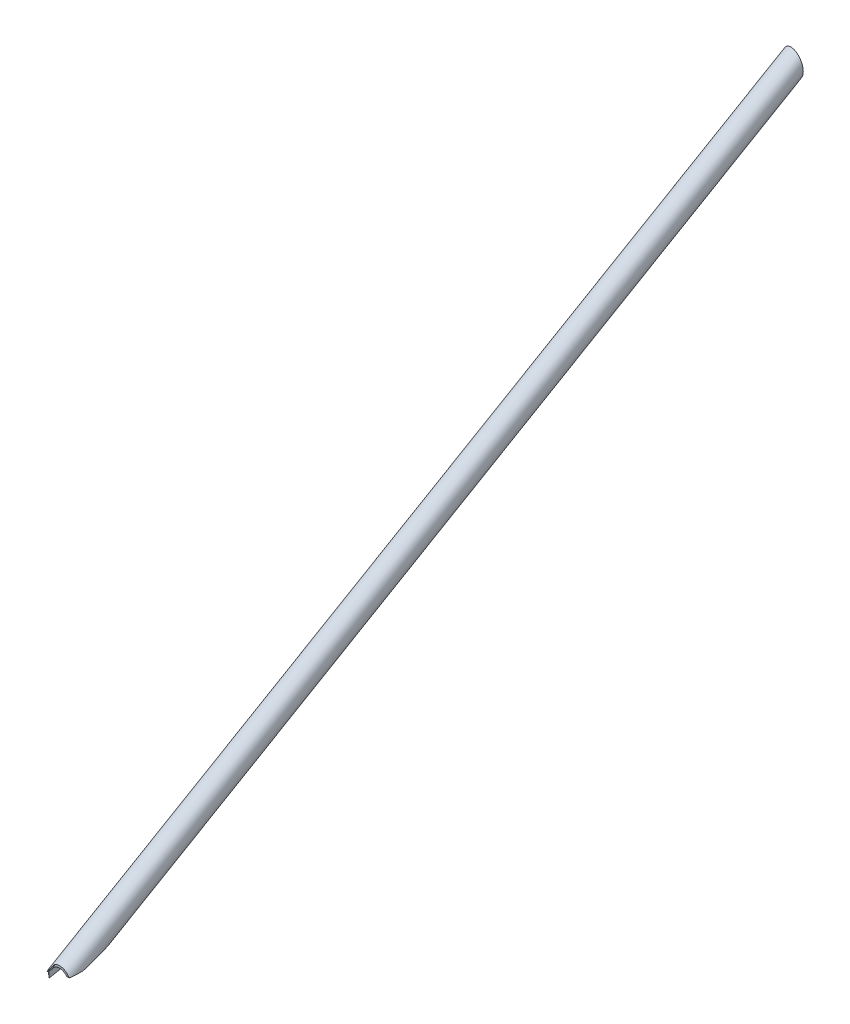
ISO-10303-21;
HEADER;
FILE_DESCRIPTION(('STEP AP214'),'2;1');
FILE_NAME('part.step','',(''),(''),'','','');
FILE_SCHEMA(('AUTOMOTIVE_DESIGN { 1 0 10303 214 1 1 1 1 }'));
ENDSEC;
DATA;
#1=APPLICATION_CONTEXT('core data for automotive mechanical design processes');
#2=APPLICATION_PROTOCOL_DEFINITION('international standard','automotive_design',2000,#1);
#3=PRODUCT_CONTEXT('',#1,'mechanical');
#4=PRODUCT('Part','Part','',(#3));
#5=PRODUCT_RELATED_PRODUCT_CATEGORY('part','',(#4));
#6=PRODUCT_DEFINITION_FORMATION('','',#4);
#7=PRODUCT_DEFINITION_CONTEXT('part definition',#1,'design');
#8=PRODUCT_DEFINITION('design','',#6,#7);
#9=PRODUCT_DEFINITION_SHAPE('','',#8);
#10=(LENGTH_UNIT() NAMED_UNIT(*) SI_UNIT(.MILLI.,.METRE.));
#11=(NAMED_UNIT(*) PLANE_ANGLE_UNIT() SI_UNIT($,.RADIAN.));
#12=(NAMED_UNIT(*) SI_UNIT($,.STERADIAN.) SOLID_ANGLE_UNIT());
#13=UNCERTAINTY_MEASURE_WITH_UNIT(LENGTH_MEASURE(1.E-05),#10,'distance_accuracy_value','');
#14=(GEOMETRIC_REPRESENTATION_CONTEXT(3) GLOBAL_UNCERTAINTY_ASSIGNED_CONTEXT((#13)) GLOBAL_UNIT_ASSIGNED_CONTEXT((#10,
#11,#12)) REPRESENTATION_CONTEXT('',''));
#15=CARTESIAN_POINT('',(0.,0.,0.));
#16=DIRECTION('',(0.,0.,1.));
#17=DIRECTION('',(1.,0.,0.));
#18=AXIS2_PLACEMENT_3D('',#15,#16,#17);
#19=CARTESIAN_POINT('',(160.,499.999999999999,-1140.));
#20=DIRECTION('',(0.0860700691861797,-0.397246473166983,0.913666888284061));
#21=DIRECTION('',(0.,-0.917070056253235,-0.39872611141445));
#22=AXIS2_PLACEMENT_3D('',#19,#20,#21);
#23=CYLINDRICAL_SURFACE('',#22,9.49999999999999);
#24=CARTESIAN_POINT('',(215.,246.153846153845,-556.153846153844));
#25=DIRECTION('',(1.,0.,0.));
#26=DIRECTION('',(0.,-0.39872611141445,0.917070056253235));
#27=AXIS2_PLACEMENT_3D('',#24,#25,#26);
#28=ELLIPSE('',#27,110.375187214621,9.49999999999999);
#29=CARTESIAN_POINT('',(215.,201.469739718146,-460.076851621221));
#30=VERTEX_POINT('',#29);
#31=CARTESIAN_POINT('',(215.,210.,-490.567372696077));
#32=VERTEX_POINT('',#31);
#33=EDGE_CURVE('E145',#30,#32,#28,.T.);
#34=ORIENTED_EDGE('',*,*,#33,.F.);
#35=CARTESIAN_POINT('',(224.056181199761,204.356086770332,-460.018999571765));
#36=DIRECTION('',(-0.00725504842418489,0.00272064315906934,0.999969980736004));
#37=DIRECTION('',(0.225878590827047,-0.974146018332496,0.004289192573552));
#38=AXIS2_PLACEMENT_3D('',#35,#36,#37);
#39=ELLIPSE('',#38,10.4174176773024,9.49999999999999);
#40=CARTESIAN_POINT('',(214.979636903003,201.53751488715,-460.077183758496));
#41=VERTEX_POINT('',#40);
#42=EDGE_CURVE('E182',#41,#30,#39,.T.);
#43=ORIENTED_EDGE('',*,*,#42,.F.);
#44=CARTESIAN_POINT('',(221.210792615593,217.488649466493,-490.223893772935));
#45=DIRECTION('',(0.936301069656275,-0.351112901121104,0.00774839511359747));
#46=DIRECTION('',(-0.130004533498693,-0.326014558550056,0.936383110101416));
#47=AXIS2_PLACEMENT_3D('',#44,#45,#46);
#48=ELLIPSE('',#47,41.8234474448927,9.49999999999999);
#49=CARTESIAN_POINT('',(214.977872090085,201.534512018379,-460.));
#50=VERTEX_POINT('',#49);
#51=EDGE_CURVE('E178',#50,#41,#48,.T.);
#52=ORIENTED_EDGE('',*,*,#51,.F.);
#53=CARTESIAN_POINT('',(224.057971014493,204.347826086956,-460.));
#54=DIRECTION('',(0.,0.,1.));
#55=DIRECTION('',(0.211753347005806,-0.977323140026797,0.));
#56=AXIS2_PLACEMENT_3D('',#53,#54,#55);
#57=ELLIPSE('',#56,10.3976625636962,9.49999999999999);
#58=CARTESIAN_POINT('',(215.,207.970881077855,-460.));
#59=VERTEX_POINT('',#58);
#60=EDGE_CURVE('E174',#59,#50,#57,.T.);
#61=ORIENTED_EDGE('',*,*,#60,.F.);
#62=CARTESIAN_POINT('',(215.,210.,-462.889777741707));
#63=VERTEX_POINT('',#62);
#64=EDGE_CURVE('E150',#63,#59,#28,.T.);
#65=ORIENTED_EDGE('',*,*,#64,.F.);
#66=CARTESIAN_POINT('',(222.833333333333,210.,-473.000000000001));
#67=DIRECTION('',(0.,-1.,0.));
#68=DIRECTION('',(0.0937876730808621,0.,0.995592221935305));
#69=AXIS2_PLACEMENT_3D('',#66,#67,#68);
#70=ELLIPSE('',#69,23.9146238965013,9.49999999999999);
#71=CARTESIAN_POINT('',(218.109575354551,210.,-454.82151752998));
#72=VERTEX_POINT('',#71);
#73=EDGE_CURVE('E105',#72,#63,#70,.T.);
#74=ORIENTED_EDGE('',*,*,#73,.F.);
#75=CARTESIAN_POINT('',(219.534447998578,213.683677808684,-460.077183758496));
#76=VERTEX_POINT('',#75);
#77=EDGE_CURVE('E184',#76,#72,#48,.T.);
#78=ORIENTED_EDGE('',*,*,#77,.F.);
#79=CARTESIAN_POINT('',(231.850175722131,210.,-459.977807601453));
#80=VERTEX_POINT('',#79);
#81=EDGE_CURVE('E207',#80,#76,#39,.T.);
#82=ORIENTED_EDGE('',*,*,#81,.F.);
#83=CARTESIAN_POINT('',(232.49120207117,210.,-471.050386456592));
#84=VERTEX_POINT('',#83);
#85=EDGE_CURVE('E86',#84,#80,#70,.T.);
#86=ORIENTED_EDGE('',*,*,#85,.F.);
#87=CARTESIAN_POINT('',(225.,200.,-450.000000000001));
#88=DIRECTION('',(0.49863554461385,-0.838230795587621,-0.220752637529415));
#89=DIRECTION('',(-0.000808316338371599,-0.255121494909782,0.966908666555272));
#90=AXIS2_PLACEMENT_3D('',#87,#88,#89);
#91=ELLIPSE('',#90,54.5326857587044,9.49999999999999);
#92=CARTESIAN_POINT('',(221.081106849014,210.,-496.8234830269));
#93=VERTEX_POINT('',#92);
#94=EDGE_CURVE('E156',#93,#84,#91,.T.);
#95=ORIENTED_EDGE('',*,*,#94,.F.);
#96=CARTESIAN_POINT('',(222.833333333333,210.,-473.000000000001));
#97=DIRECTION('',(0.,-1.,0.));
#98=DIRECTION('',(0.0937876730808621,0.,0.995592221935305));
#99=AXIS2_PLACEMENT_3D('',#96,#97,#98);
#100=ELLIPSE('',#99,23.9146238965013,9.49999999999999);
#101=EDGE_CURVE('E140',#32,#93,#100,.T.);
#102=ORIENTED_EDGE('',*,*,#101,.F.);
#103=EDGE_LOOP('',(#34,#43,#52,#61,#65,#74,#78,#82,#86,#95,#102));
#104=FACE_BOUND('',#103,.T.);
#105=CARTESIAN_POINT('',(160.,499.999999999999,-1140.));
#106=DIRECTION('',(0.133991346812806,0.0219122293107188,-0.990740214781819));
#107=DIRECTION('',(0.480296136468892,-0.8759210569698,0.0455842434396289));
#108=AXIS2_PLACEMENT_3D('',#105,#106,#107);
#109=ELLIPSE('',#108,10.5277337911105,9.49999999999999);
#110=CARTESIAN_POINT('',(165.056429865643,490.778536290193,-1139.52010122));
#111=VERTEX_POINT('',#110);
#112=EDGE_CURVE('E11',#111,#111,#109,.T.);
#113=ORIENTED_EDGE('',*,*,#112,.F.);
#114=EDGE_LOOP('',(#113));
#115=FACE_BOUND('',#114,.T.);
#116=ADVANCED_FACE('F41',(#104,#115),#23,.T.);
#117=CARTESIAN_POINT('',(160.,499.999999999999,-1140.));
#118=DIRECTION('',(0.0860700691861797,-0.397246473166983,0.913666888284061));
#119=DIRECTION('',(0.,-0.917070056253235,-0.39872611141445));
#120=AXIS2_PLACEMENT_3D('',#117,#118,#119);
#121=CYLINDRICAL_SURFACE('',#120,7.90000000000002);
#122=CARTESIAN_POINT('',(215.,246.153846153845,-556.153846153844));
#123=DIRECTION('',(1.,0.,0.));
#124=DIRECTION('',(0.,-0.39872611141445,0.917070056253235));
#125=AXIS2_PLACEMENT_3D('',#122,#123,#124);
#126=ELLIPSE('',#125,91.7856819995275,7.90000000000002);
#127=CARTESIAN_POINT('',(215.,210.,-471.932494813856));
#128=VERTEX_POINT('',#127);
#129=CARTESIAN_POINT('',(215.,210.,-481.524655623929));
#130=VERTEX_POINT('',#129);
#131=EDGE_CURVE('E163',#128,#130,#126,.T.);
#132=ORIENTED_EDGE('',*,*,#131,.T.);
#133=CARTESIAN_POINT('',(222.833333333333,210.,-473.000000000001));
#134=DIRECTION('',(0.,-1.,0.));
#135=DIRECTION('',(0.0937876730808621,0.,0.995592221935305));
#136=AXIS2_PLACEMENT_3D('',#133,#134,#135);
#137=ELLIPSE('',#136,19.8868977665643,7.90000000000002);
#138=CARTESIAN_POINT('',(221.009082769325,210.,-492.802823508089));
#139=VERTEX_POINT('',#138);
#140=EDGE_CURVE('E60',#130,#139,#137,.T.);
#141=ORIENTED_EDGE('',*,*,#140,.T.);
#142=CARTESIAN_POINT('',(221.206568880776,210.263290182785,-493.418666622701));
#143=CARTESIAN_POINT('',(221.24763602655,210.317024440827,-493.542253770486));
#144=CARTESIAN_POINT('',(221.289475231551,210.371142845929,-493.665416469731));
#145=CARTESIAN_POINT('',(221.37485292463,210.480210508638,-493.910780677234));
#146=CARTESIAN_POINT('',(221.418391415822,210.535159767768,-494.032982183729));
#147=CARTESIAN_POINT('',(221.551828139382,210.701384621658,-494.398033164984));
#148=CARTESIAN_POINT('',(221.644526148781,210.814009041336,-494.639263839927));
#149=CARTESIAN_POINT('',(221.83876128836,211.043071083751,-495.115006586274));
#150=CARTESIAN_POINT('',(221.940262520965,211.159492114586,-495.349541198734));
#151=CARTESIAN_POINT('',(222.154890911069,211.397440568374,-495.810509707501));
#152=CARTESIAN_POINT('',(222.26801147291,211.518965071456,-496.036948102247));
#153=CARTESIAN_POINT('',(222.471310586725,211.728721936814,-496.40749972045));
#154=CARTESIAN_POINT('',(222.557321084273,211.815230234477,-496.554863241666));
#155=CARTESIAN_POINT('',(222.738896853221,211.992249442316,-496.842486709506));
#156=CARTESIAN_POINT('',(222.834506462807,212.082777737785,-496.982708717165));
#157=CARTESIAN_POINT('',(223.000346563755,212.234106161838,-497.202205496389));
#158=CARTESIAN_POINT('',(223.067050160009,212.293653297298,-497.284995737302));
#159=CARTESIAN_POINT('',(223.206168393208,212.414646938639,-497.444385884673));
#160=CARTESIAN_POINT('',(223.278587694967,212.476094970523,-497.520980629332));
#161=CARTESIAN_POINT('',(223.429587115171,212.6004590513,-497.665124716256));
#162=CARTESIAN_POINT('',(223.50812033078,212.663361738907,-497.732733877046));
#163=CARTESIAN_POINT('',(223.672714744383,212.790752884129,-497.856084793355));
#164=CARTESIAN_POINT('',(223.758758183612,212.855237354833,-497.911853528682));
#165=CARTESIAN_POINT('',(223.920103693399,212.971399791352,-497.9968323799));
#166=CARTESIAN_POINT('',(223.993850297499,213.022913997903,-498.029162430595));
#167=CARTESIAN_POINT('',(224.146160578873,213.125554796371,-498.080494986602));
#168=CARTESIAN_POINT('',(224.224719705277,213.176681704639,-498.099509877876));
#169=CARTESIAN_POINT('',(224.38617880824,213.277584545833,-498.121424543779));
#170=CARTESIAN_POINT('',(224.469114848965,213.327341413829,-498.124158202155));
#171=CARTESIAN_POINT('',(224.635848504421,213.422932284612,-498.111412504406));
#172=CARTESIAN_POINT('',(224.719645669073,213.468768230483,-498.095942226311));
#173=CARTESIAN_POINT('',(224.876341820267,213.550403738948,-498.050268318093));
#174=CARTESIAN_POINT('',(224.949465894969,213.586751470815,-498.02176968404));
#175=CARTESIAN_POINT('',(225.092325922515,213.654578850639,-497.953002677361));
#176=CARTESIAN_POINT('',(225.162059268603,213.686054792563,-497.912725411221));
#177=CARTESIAN_POINT('',(225.33586909051,213.760839588025,-497.797237339318));
#178=CARTESIAN_POINT('',(225.436869474996,213.800669165127,-497.715199359516));
#179=CARTESIAN_POINT('',(225.628497669874,213.870581705605,-497.536224843525));
#180=CARTESIAN_POINT('',(225.71909192164,213.90063367834,-497.439242343984));
#181=CARTESIAN_POINT('',(225.889447471959,213.952531901614,-497.237805899417));
#182=CARTESIAN_POINT('',(225.969388899094,213.974529961469,-497.133539715714));
#183=CARTESIAN_POINT('',(226.122050400932,214.01276590762,-496.91878199434));
#184=CARTESIAN_POINT('',(226.194762850137,214.028997756886,-496.80828407163));
#185=CARTESIAN_POINT('',(226.334307512918,214.056909699823,-496.582750976098));
#186=CARTESIAN_POINT('',(226.401124910796,214.06857856456,-496.467705367795));
#187=CARTESIAN_POINT('',(226.529640485098,214.08818516228,-496.234587014542));
#188=CARTESIAN_POINT('',(226.591341167102,214.096124730435,-496.116515788718));
#189=CARTESIAN_POINT('',(226.758248677112,214.114107945518,-495.782480887136));
#190=CARTESIAN_POINT('',(226.858665365434,214.12073307924,-495.56394465914));
#191=CARTESIAN_POINT('',(227.048988321381,214.126760290318,-495.122197528776));
#192=CARTESIAN_POINT('',(227.138887790288,214.126157721189,-494.898983711358));
#193=CARTESIAN_POINT('',(227.31047884865,214.119378263407,-494.449009376469));
#194=CARTESIAN_POINT('',(227.39215324043,214.113189954012,-494.222242528245));
#195=CARTESIAN_POINT('',(227.548641776458,214.0963742832,-493.766511529491));
#196=CARTESIAN_POINT('',(227.623455108164,214.08574639684,-493.537547122246));
#197=CARTESIAN_POINT('',(227.767707104586,214.060802564154,-493.076835584819));
#198=CARTESIAN_POINT('',(227.83711589841,214.046467785646,-492.845080182285));
#199=CARTESIAN_POINT('',(227.970982570093,214.014747608496,-492.380346736947));
#200=CARTESIAN_POINT('',(228.035440187691,213.997362049647,-492.147368630557));
#201=CARTESIAN_POINT('',(228.159967499585,213.960032518885,-491.680809017138));
#202=CARTESIAN_POINT('',(228.220043310874,213.940092224971,-491.447228841567));
#203=CARTESIAN_POINT('',(228.336414238128,213.897993489759,-490.979338278626));
#204=CARTESIAN_POINT('',(228.392709436216,213.875835096671,-490.745027907234));
#205=CARTESIAN_POINT('',(228.555595442897,213.80688633244,-490.045360544733));
#206=CARTESIAN_POINT('',(228.657272283335,213.757280697125,-489.579133222931));
#207=CARTESIAN_POINT('',(228.849819414667,213.652198896083,-488.64509410507));
#208=CARTESIAN_POINT('',(228.940688571855,213.596722115635,-488.17728214807));
#209=CARTESIAN_POINT('',(229.113257680536,213.481050604128,-487.240387798909));
#210=CARTESIAN_POINT('',(229.194954394139,213.420854219695,-486.771305017615));
#211=CARTESIAN_POINT('',(229.350317386864,213.296645393978,-485.832313418318));
#212=CARTESIAN_POINT('',(229.42398348538,213.23263286692,-485.362404581978));
#213=CARTESIAN_POINT('',(229.564283936547,213.101355790028,-484.421017111337));
#214=CARTESIAN_POINT('',(229.630903923019,213.034084988918,-483.949537217414));
#215=CARTESIAN_POINT('',(229.757585232618,212.896983138402,-483.006068564256));
#216=CARTESIAN_POINT('',(229.817646501834,212.827152067957,-482.53407980087));
#217=CARTESIAN_POINT('',(229.931670881912,212.685436347365,-481.589783256186));
#218=CARTESIAN_POINT('',(229.985635325989,212.613552150506,-481.117475567441));
#219=CARTESIAN_POINT('',(230.087813710594,212.468152523231,-480.172487594285));
#220=CARTESIAN_POINT('',(230.136027587957,212.394637074907,-479.699807305837));
#221=CARTESIAN_POINT('',(230.272172361841,212.172638296911,-478.283691176929));
#222=CARTESIAN_POINT('',(230.351897815715,212.02233255526,-477.339743095667));
#223=CARTESIAN_POINT('',(230.490065575632,211.719973662121,-475.450471077386));
#224=CARTESIAN_POINT('',(230.548505722051,211.567920334934,-474.505147010521));
#225=CARTESIAN_POINT('',(230.619297941826,211.341265622081,-473.086720605435));
#226=CARTESIAN_POINT('',(230.640076226248,211.265998559525,-472.614136233216));
#227=CARTESIAN_POINT('',(230.675680352091,211.116431681738,-471.668592756938));
#228=CARTESIAN_POINT('',(230.690506275443,211.042131853207,-471.195633658127));
#229=CARTESIAN_POINT('',(230.713710041289,210.895106381529,-470.249368554736));
#230=CARTESIAN_POINT('',(230.722088652785,210.82238055165,-469.776062598271));
#231=CARTESIAN_POINT('',(230.731678914752,210.679214204868,-468.829038954714));
#232=CARTESIAN_POINT('',(230.732890790453,210.608773616215,-468.355321281027));
#233=CARTESIAN_POINT('',(230.728358435291,210.500778389708,-467.611994992169));
#234=CARTESIAN_POINT('',(230.725390373751,210.462150141929,-467.342524579462));
#235=CARTESIAN_POINT('',(230.716545852681,210.386116802002,-466.803460843759));
#236=CARTESIAN_POINT('',(230.710669410964,210.348711702363,-466.533867521525));
#237=CARTESIAN_POINT('',(230.68824147216,210.238634164323,-465.72479863838));
#238=CARTESIAN_POINT('',(230.666891821066,210.168116317744,-465.185148789931));
#239=CARTESIAN_POINT('',(230.608155550909,210.034970650155,-464.105558243796));
#240=CARTESIAN_POINT('',(230.570765586523,209.972344478539,-463.565617508918));
#241=CARTESIAN_POINT('',(230.498829143226,209.88655695796,-462.756307107994));
#242=CARTESIAN_POINT('',(230.472211816641,209.859322023094,-462.486663635447));
#243=CARTESIAN_POINT('',(230.412784146961,209.808030409134,-461.947763649966));
#244=CARTESIAN_POINT('',(230.379974132465,209.783973561517,-461.678507117263));
#245=CARTESIAN_POINT('',(230.297625627222,209.733785756237,-461.070888440203));
#246=CARTESIAN_POINT('',(230.245955501482,209.708735508834,-460.732718053255));
#247=CARTESIAN_POINT('',(230.128274899238,209.665665644381,-460.05845695348));
#248=CARTESIAN_POINT('',(230.062267896045,209.647644327424,-459.722365757188));
#249=CARTESIAN_POINT('',(229.912282587082,209.619916909707,-459.054235612171));
#250=CARTESIAN_POINT('',(229.828326932524,209.610200404807,-458.72219210842));
#251=CARTESIAN_POINT('',(229.637662254277,209.600260068688,-458.064546550202));
#252=CARTESIAN_POINT('',(229.53096621841,209.600030833486,-457.738940934345));
#253=CARTESIAN_POINT('',(229.333702473084,209.607911479663,-457.216609863652));
#254=CARTESIAN_POINT('',(229.251682822933,209.612979152088,-457.016611859171));
#255=CARTESIAN_POINT('',(229.07479234033,209.627043709528,-456.622553268572));
#256=CARTESIAN_POINT('',(228.979926215562,209.636039157854,-456.428490539217));
#257=CARTESIAN_POINT('',(228.776074445682,209.657532816246,-456.048436287802));
#258=CARTESIAN_POINT('',(228.667109326657,209.670025964353,-455.86243354704));
#259=CARTESIAN_POINT('',(228.433900143864,209.697663972042,-455.500424636068));
#260=CARTESIAN_POINT('',(228.309656710211,209.712808722275,-455.324418054028));
#261=CARTESIAN_POINT('',(228.043707705437,209.744588729692,-454.982514137989));
#262=CARTESIAN_POINT('',(227.901796611905,209.761240766372,-454.816777465886));
#263=CARTESIAN_POINT('',(227.602160884021,209.793932950358,-454.500166753869));
#264=CARTESIAN_POINT('',(227.444436225824,209.809973096743,-454.349292736367));
#265=CARTESIAN_POINT('',(227.114363847085,209.839158795709,-454.064087309666));
#266=CARTESIAN_POINT('',(226.942012847503,209.852303696826,-453.929759626579));
#267=CARTESIAN_POINT('',(226.584664770271,209.873299784483,-453.678681505095));
#268=CARTESIAN_POINT('',(226.399668660318,209.881151375606,-453.561929723844));
#269=CARTESIAN_POINT('',(226.048535733514,209.888697597746,-453.362761236534));
#270=CARTESIAN_POINT('',(225.883841210063,209.889456017418,-453.277824203534));
#271=CARTESIAN_POINT('',(225.548661482705,209.884388536967,-453.120562915579));
#272=CARTESIAN_POINT('',(225.378177041665,209.878563501029,-453.048237006652));
#273=CARTESIAN_POINT('',(225.032905344179,209.859345938463,-452.915800495379));
#274=CARTESIAN_POINT('',(224.858116994976,209.845951470618,-452.855693031892));
#275=CARTESIAN_POINT('',(224.505753815866,209.810825453866,-452.74722063983));
#276=CARTESIAN_POINT('',(224.328178806706,209.789093366516,-452.698856469967));
#277=CARTESIAN_POINT('',(223.964288341598,209.735645532319,-452.611575094616));
#278=CARTESIAN_POINT('',(223.777914688264,209.703554673475,-452.573130305149));
#279=CARTESIAN_POINT('',(223.405153602149,209.629300090749,-452.507804732942));
#280=CARTESIAN_POINT('',(223.218766169238,209.587136255666,-452.480924077875));
#281=CARTESIAN_POINT('',(222.847329102588,209.492508212151,-452.43817635807));
#282=CARTESIAN_POINT('',(222.662279617702,209.440042875365,-452.422310500679));
#283=CARTESIAN_POINT('',(222.294815229728,209.324769131743,-452.401117013458));
#284=CARTESIAN_POINT('',(222.112400442995,209.261960269624,-452.395789847636));
#285=CARTESIAN_POINT('',(221.738391139772,209.121215279601,-452.39525518459));
#286=CARTESIAN_POINT('',(221.547082208905,209.04251527398,-452.40080448492));
#287=CARTESIAN_POINT('',(221.170248531064,208.873685971422,-452.423167101231));
#288=CARTESIAN_POINT('',(220.984724053813,208.783556142517,-452.439980941644));
#289=CARTESIAN_POINT('',(220.6207107629,208.592363088435,-452.484601527725));
#290=CARTESIAN_POINT('',(220.442223556292,208.491297385412,-452.512410768532));
#291=CARTESIAN_POINT('',(220.09353542017,208.278947801628,-452.578856336154));
#292=CARTESIAN_POINT('',(219.923334518681,208.167663886309,-452.617492699586));
#293=CARTESIAN_POINT('',(219.588483450515,207.933055411936,-452.706563984867));
#294=CARTESIAN_POINT('',(219.42405468805,207.809510887833,-452.757252594292));
#295=CARTESIAN_POINT('',(219.10615270817,207.553790278829,-452.869972402233));
#296=CARTESIAN_POINT('',(218.95267975429,207.421613986442,-452.932003873468));
#297=CARTESIAN_POINT('',(218.657672060116,207.149982093815,-453.067600827607));
#298=CARTESIAN_POINT('',(218.516139613274,207.010525103435,-453.141168518589));
#299=CARTESIAN_POINT('',(218.245943493633,206.7259830125,-453.300115228278));
#300=CARTESIAN_POINT('',(218.117279566049,206.580898023452,-453.385494013057));
#301=CARTESIAN_POINT('',(217.875202474643,206.288959687769,-453.567215934068));
#302=CARTESIAN_POINT('',(217.761608957251,206.142155656645,-453.663397830827));
#303=CARTESIAN_POINT('',(217.548254272982,205.847028746672,-453.868021510903));
#304=CARTESIAN_POINT('',(217.448493096252,205.698705868904,-453.976463285488));
#305=CARTESIAN_POINT('',(217.263250175893,205.403078661119,-454.205864207285));
#306=CARTESIAN_POINT('',(217.177755348973,205.255773517959,-454.326811719076));
#307=CARTESIAN_POINT('',(217.021029483746,204.964698126618,-454.581526296707));
#308=CARTESIAN_POINT('',(216.949797145628,204.820927557363,-454.715292192701));
#309=CARTESIAN_POINT('',(216.825578999173,204.548997061447,-454.986333065393));
#310=CARTESIAN_POINT('',(216.771699085233,204.420433143722,-455.1227934648));
#311=CARTESIAN_POINT('',(216.675630343987,204.17106264122,-455.406484685212));
#312=CARTESIAN_POINT('',(216.633440643662,204.05025547769,-455.553714700909));
#313=CARTESIAN_POINT('',(216.559921694377,203.818447312023,-455.858157372179));
#314=CARTESIAN_POINT('',(216.528588126709,203.707442423541,-456.015366028604));
#315=CARTESIAN_POINT('',(216.475629414044,203.496750823568,-456.338733928679));
#316=CARTESIAN_POINT('',(216.45400428071,203.397064125674,-456.504893183081));
#317=CARTESIAN_POINT('',(216.42016703457,203.21550575952,-456.834767286392));
#318=CARTESIAN_POINT('',(216.407474697298,203.13292989632,-456.998047621233));
#319=CARTESIAN_POINT('',(216.388346819747,202.978947276735,-457.330114893921));
#320=CARTESIAN_POINT('',(216.381910984863,202.907539994579,-457.498901572098));
#321=CARTESIAN_POINT('',(216.374163975502,202.775721335151,-457.840820884238));
#322=CARTESIAN_POINT('',(216.372853313513,202.715311058091,-458.013953951071));
#323=CARTESIAN_POINT('',(216.374330297282,202.604974048247,-458.363505401798));
#324=CARTESIAN_POINT('',(216.377118366562,202.55504839945,-458.539924123338));
#325=CARTESIAN_POINT('',(216.385726055784,202.466810707638,-458.887784590109));
#326=CARTESIAN_POINT('',(216.391415492574,202.428103665094,-459.05913030753));
#327=CARTESIAN_POINT('',(216.405108337207,202.358894657499,-459.403389434937));
#328=CARTESIAN_POINT('',(216.413112202969,202.328394318482,-459.576303148591));
#329=CARTESIAN_POINT('',(216.439793331318,202.247993470552,-460.096852329234));
#330=CARTESIAN_POINT('',(216.461134219192,202.209239148741,-460.446106502896));
#331=CARTESIAN_POINT('',(216.496310574703,202.168964580434,-460.971785915251));
#332=CARTESIAN_POINT('',(216.508598092534,202.15851230802,-461.147752316572));
#333=CARTESIAN_POINT('',(216.533996910205,202.142991747493,-461.499878075861));
#334=CARTESIAN_POINT('',(216.54710821969,202.13792352242,-461.676037436063));
#335=CARTESIAN_POINT('',(216.573952035643,202.132585582371,-462.028285097646));
#336=CARTESIAN_POINT('',(216.587684236087,202.132313528751,-462.204373391792));
#337=CARTESIAN_POINT('',(216.615637319007,202.13604769316,-462.556457553338));
#338=CARTESIAN_POINT('',(216.629858190987,202.14005381936,-462.732453422642));
#339=CARTESIAN_POINT('',(216.673081313403,202.157788093482,-463.260091515437));
#340=CARTESIAN_POINT('',(216.702653031647,202.177231012802,-463.611499911409));
#341=CARTESIAN_POINT('',(216.762784508385,202.228368651599,-464.313361549556));
#342=CARTESIAN_POINT('',(216.793344458148,202.260065755994,-464.663814592419));
#343=CARTESIAN_POINT('',(216.855215326194,202.333478527748,-465.363817206511));
#344=CARTESIAN_POINT('',(216.886526711666,202.375200581212,-465.713366057705));
#345=CARTESIAN_POINT('',(216.949776488414,202.466918134128,-466.411330215987));
#346=CARTESIAN_POINT('',(216.981714921331,202.5169141847,-466.759745445989));
#347=CARTESIAN_POINT('',(217.046281589515,202.623974515709,-467.456338523928));
#348=CARTESIAN_POINT('',(217.078911382362,202.681056576088,-467.804513476956));
#349=CARTESIAN_POINT('',(217.144815605675,202.801147453799,-468.499782429597));
#350=CARTESIAN_POINT('',(217.178090055463,202.864156448986,-468.846876396448));
#351=CARTESIAN_POINT('',(217.278944061726,203.060741763683,-469.88633835774));
#352=CARTESIAN_POINT('',(217.347580395893,203.201921329269,-470.577169077623));
#353=CARTESIAN_POINT('',(217.488669134204,203.500529492385,-471.958208160934));
#354=CARTESIAN_POINT('',(217.561137528852,203.658029326894,-472.6483992859));
#355=CARTESIAN_POINT('',(217.710418580907,203.985781424678,-474.025327861576));
#356=CARTESIAN_POINT('',(217.787231598869,204.156034746733,-474.712065020481));
#357=CARTESIAN_POINT('',(217.945935764989,204.507037872377,-476.081012246224));
#358=CARTESIAN_POINT('',(218.027818183218,204.687769598955,-476.76322797278));
#359=CARTESIAN_POINT('',(218.197725166455,205.0587542087,-478.124273193502));
#360=CARTESIAN_POINT('',(218.285749529096,205.249006778113,-478.803102798445));
#361=CARTESIAN_POINT('',(218.458337222137,205.615619063556,-480.07829015614));
#362=CARTESIAN_POINT('',(218.542107036849,205.79101150404,-480.675033584962));
#363=CARTESIAN_POINT('',(218.71616147589,206.148443329242,-481.865587105592));
#364=CARTESIAN_POINT('',(218.80644620242,206.330482818212,-482.459397151227));
#365=CARTESIAN_POINT('',(218.994685300618,206.701397225738,-483.644398185001));
#366=CARTESIAN_POINT('',(219.092648018514,206.890279459246,-484.235585563753));
#367=CARTESIAN_POINT('',(219.297473892455,207.274897452752,-485.414162446492));
#368=CARTESIAN_POINT('',(219.404336701563,207.470632945428,-486.00155209756));
#369=CARTESIAN_POINT('',(219.628279592393,207.868704014768,-487.169638910291));
#370=CARTESIAN_POINT('',(219.74532040936,208.07101249304,-487.750352792353));
#371=CARTESIAN_POINT('',(219.992289923567,208.483754425722,-488.906284434597));
#372=CARTESIAN_POINT('',(220.122220706249,208.694189191492,-489.481501288868));
#373=CARTESIAN_POINT('',(220.329223051012,209.016743971925,-490.338325348291));
#374=CARTESIAN_POINT('',(220.400188925783,209.125336137965,-490.622740918637));
#375=CARTESIAN_POINT('',(220.546771954701,209.345105951835,-491.189361956757));
#376=CARTESIAN_POINT('',(220.622388948547,209.456283510476,-491.471567500322));
#377=CARTESIAN_POINT('',(220.778977440771,209.681487914314,-492.033243091863));
#378=CARTESIAN_POINT('',(220.859947306912,209.795513884416,-492.312713944153));
#379=CARTESIAN_POINT('',(221.028202206946,210.026826956482,-492.868374494853));
#380=CARTESIAN_POINT('',(221.115486658167,210.144113756943,-493.144564493269));
#381=CARTESIAN_POINT('',(221.206568880776,210.263290182785,-493.418666622701));
#382=B_SPLINE_CURVE_WITH_KNOTS('',3,(#142,#143,#144,#145,#146,#147,#148,#149,#150,#151,#152,
#153,#154,#155,#156,#157,#158,#159,#160,#161,#162,#163,#164,#165,#166,#167,#168,#169,#170,#171,
#172,#173,#174,#175,#176,#177,#178,#179,#180,#181,#182,#183,#184,#185,#186,#187,#188,#189,#190,
#191,#192,#193,#194,#195,#196,#197,#198,#199,#200,#201,#202,#203,#204,#205,#206,#207,#208,#209,
#210,#211,#212,#213,#214,#215,#216,#217,#218,#219,#220,#221,#222,#223,#224,#225,#226,#227,#228,
#229,#230,#231,#232,#233,#234,#235,#236,#237,#238,#239,#240,#241,#242,#243,#244,#245,#246,#247,
#248,#249,#250,#251,#252,#253,#254,#255,#256,#257,#258,#259,#260,#261,#262,#263,#264,#265,#266,
#267,#268,#269,#270,#271,#272,#273,#274,#275,#276,#277,#278,#279,#280,#281,#282,#283,#284,#285,
#286,#287,#288,#289,#290,#291,#292,#293,#294,#295,#296,#297,#298,#299,#300,#301,#302,#303,#304,
#305,#306,#307,#308,#309,#310,#311,#312,#313,#314,#315,#316,#317,#318,#319,#320,#321,#322,#323,
#324,#325,#326,#327,#328,#329,#330,#331,#332,#333,#334,#335,#336,#337,#338,#339,#340,#341,#342,
#343,#344,#345,#346,#347,#348,#349,#350,#351,#352,#353,#354,#355,#356,#357,#358,#359,#360,#361,
#362,#363,#364,#365,#366,#367,#368,#369,#370,#371,#372,#373,#374,#375,#376,#377,#378,#379,#380,
#381),.UNSPECIFIED.,.T.,.F.,(4,2,2,2,2,2,2,2,2,2,2,2,2,2,2,2,2,2,2,2,2,2,2,2,2,2,2,2,2,2,2,2,2,
2,2,2,2,2,2,2,2,2,2,2,2,2,2,2,2,2,2,2,2,2,2,2,2,2,2,2,2,2,2,2,2,2,2,2,2,2,2,2,2,2,2,2,2,2,2,2,2,
2,2,2,2,2,2,2,2,2,2,2,2,2,2,2,2,2,2,2,2,2,2,2,2,2,2,2,2,2,2,2,2,2,2,2,2,2,2,4),(0.,
0.42263859778341,0.845277970048846,1.69077947533352,2.53298219259455,3.37470945200835,
3.94834863145962,4.52477132350539,4.89011775761368,5.25576551159906,5.61884208612772,
5.98108225157868,6.26701519294028,6.55268180054865,6.84125811806613,7.12969058787631,
7.38803932322587,7.64658363192081,8.05247134395539,8.45963328231438,8.85866850929187,
9.25812028997865,9.65854897652575,10.0587804066333,10.7799681668086,11.5016195830627,
12.224749856285,12.9479656579658,13.6749303863001,14.4019333017684,15.1279010866813,
15.8538530967186,17.2929000801514,18.7320978840859,20.1718021405268,21.6115387686692,
23.0541564466167,24.4967859816387,25.9390994385392,27.3814287363874,30.2586430684032,
33.1361492436066,34.5730932399444,36.0100174571758,37.446770258674,38.8834779067104,
39.7001851397415,40.5168873707957,42.1506393126596,43.7847321512253,44.6016175757044,
45.4184596665734,46.4471896996978,47.4756707858967,48.5028615103264,49.5294671350329,
50.1777217362516,50.8257394195395,51.4728240805769,52.1198820632129,52.7753296083375,
53.4307781418518,54.086374008769,54.7419197606787,55.2972158051837,55.8524389666949,
56.4078045825261,56.9632060698977,57.5415358087583,58.1198719324333,58.698271438351,
59.2766964101229,59.896798018752,60.516928498899,61.1371997834162,61.7574731657215,
62.3921838101731,63.0269097170514,63.6617572615431,64.2965922341598,64.9229689894915,
65.5493452987198,66.1751439797217,66.8008856026494,67.3853195958583,67.9697099320771,
68.5538675227444,69.138025815229,69.6877074149252,70.2373631300477,70.7870738061506,
71.3368412879867,71.8638655319001,72.3909941208608,73.4458339298919,73.9758991364786,
74.5059705492256,75.0357834885126,75.5655850558511,76.6248403977422,77.6843019965163,
78.7444402924668,79.8046492313918,80.8675743175037,81.9305313102676,84.0555834701461,
86.1903368088882,88.3252675692359,90.4566188986868,92.5879000367991,94.4706323942215,
96.3533942926407,98.2382319827068,100.122996233437,102.000787216878,103.878882501367,
104.816649800477,105.75438479744,106.691835160723,107.629199131889),.UNSPECIFIED.);
#383=CARTESIAN_POINT('',(230.584130699584,210.,-463.793581811255));
#384=VERTEX_POINT('',#383);
#385=EDGE_CURVE('E162',#139,#384,#382,.T.);
#386=ORIENTED_EDGE('',*,*,#385,.T.);
#387=CARTESIAN_POINT('',(222.833333333333,210.,-473.000000000001));
#388=DIRECTION('',(0.,-1.,0.));
#389=DIRECTION('',(0.0937876730808621,0.,0.995592221935305));
#390=AXIS2_PLACEMENT_3D('',#387,#388,#389);
#391=ELLIPSE('',#390,19.8868977665643,7.90000000000002);
#392=CARTESIAN_POINT('',(229.845132294161,210.,-459.992354725309));
#393=VERTEX_POINT('',#392);
#394=EDGE_CURVE('E95',#384,#393,#391,.T.);
#395=ORIENTED_EDGE('',*,*,#394,.T.);
#396=CARTESIAN_POINT('',(224.056181199761,204.356086770332,-460.018999571765));
#397=DIRECTION('',(-0.00725504842418489,0.00272064315906934,0.999969980736004));
#398=DIRECTION('',(0.225878590827047,-0.974146018332496,0.004289192573552));
#399=AXIS2_PLACEMENT_3D('',#396,#397,#398);
#400=ELLIPSE('',#399,8.66290522638837,7.90000000000002);
#401=CARTESIAN_POINT('',(218.397401228268,210.651553087858,-460.077183758496));
#402=VERTEX_POINT('',#401);
#403=EDGE_CURVE('E191',#393,#402,#400,.T.);
#404=ORIENTED_EDGE('',*,*,#403,.T.);
#405=CARTESIAN_POINT('',(221.210792615593,217.488649466493,-490.223893772935));
#406=DIRECTION('',(0.936301069656275,-0.351112901121104,0.00774839511359747));
#407=DIRECTION('',(-0.130004533498693,-0.326014558550056,0.936383110101416));
#408=AXIS2_PLACEMENT_3D('',#405,#406,#407);
#409=ELLIPSE('',#408,34.7794984015424,7.90000000000002);
#410=CARTESIAN_POINT('',(218.147411153353,210.,-459.393522231583));
#411=VERTEX_POINT('',#410);
#412=EDGE_CURVE('E197',#402,#411,#409,.T.);
#413=ORIENTED_EDGE('',*,*,#412,.T.);
#414=EDGE_CURVE('E75',#411,#128,#391,.T.);
#415=ORIENTED_EDGE('',*,*,#414,.T.);
#416=EDGE_LOOP('',(#132,#141,#386,#395,#404,#413,#415));
#417=FACE_BOUND('',#416,.T.);
#418=CARTESIAN_POINT('',(160.,499.999999999999,-1140.));
#419=DIRECTION('',(0.133991346812806,0.0219122293107188,-0.990740214781819));
#420=DIRECTION('',(0.480296136468892,-0.8759210569698,0.0455842434396289));
#421=AXIS2_PLACEMENT_3D('',#418,#419,#420);
#422=ELLIPSE('',#421,8.75464178418664,7.90000000000002);
#423=CARTESIAN_POINT('',(164.204820625114,492.331624915003,-1139.60092627768));
#424=VERTEX_POINT('',#423);
#425=EDGE_CURVE('E45',#424,#424,#422,.T.);
#426=ORIENTED_EDGE('',*,*,#425,.T.);
#427=EDGE_LOOP('',(#426));
#428=FACE_BOUND('',#427,.T.);
#429=ADVANCED_FACE('F213',(#417,#428),#121,.F.);
#430=CARTESIAN_POINT('',(325.000000000001,320.,-1580.));
#431=DIRECTION('',(-0.0876619818920292,-0.105194378270435,0.99058039537993));
#432=DIRECTION('',(0.,-0.994408591727349,-0.105600912395825));
#433=AXIS2_PLACEMENT_3D('',#430,#431,#432);
#434=CYLINDRICAL_SURFACE('',#433,9.49999999999999);
#435=ORIENTED_EDGE('',*,*,#385,.F.);
#436=CARTESIAN_POINT('',(233.333333333334,210.,-544.166666666668));
#437=DIRECTION('',(0.,-1.,0.));
#438=DIRECTION('',(-0.0881510722971012,0.,0.996107116957243));
#439=AXIS2_PLACEMENT_3D('',#436,#437,#438);
#440=ELLIPSE('',#439,90.3090084869104,9.49999999999999);
#441=EDGE_CURVE('E192',#139,#93,#440,.T.);
#442=ORIENTED_EDGE('',*,*,#441,.T.);
#443=ORIENTED_EDGE('',*,*,#94,.T.);
#444=EDGE_CURVE('E160',#84,#384,#440,.T.);
#445=ORIENTED_EDGE('',*,*,#444,.T.);
#446=EDGE_LOOP('',(#435,#442,#443,#445));
#447=FACE_BOUND('',#446,.T.);
#448=ADVANCED_FACE('F216',(#447),#434,.F.);
#449=CARTESIAN_POINT('',(225.,190.,-460.));
#450=DIRECTION('',(0.,0.,1.));
#451=DIRECTION('',(1.,0.,0.));
#452=AXIS2_PLACEMENT_3D('',#449,#450,#451);
#453=PLANE('',#452);
#454=DIRECTION('',(0.351123441588392,0.936329177569045,0.));
#455=VECTOR('',#454,1.);
#456=CARTESIAN_POINT('',(212.421308566087,194.717009287718,-460.));
#457=LINE('',#456,#455);
#458=CARTESIAN_POINT('',(215.,201.593519778154,-460.));
#459=VERTEX_POINT('',#458);
#460=EDGE_CURVE('E175',#50,#459,#457,.T.);
#461=ORIENTED_EDGE('',*,*,#460,.T.);
#462=DIRECTION('',(0.,1.,0.));
#463=VECTOR('',#462,1.);
#464=CARTESIAN_POINT('',(215.,190.,-460.));
#465=LINE('',#464,#463);
#466=EDGE_CURVE('E172',#459,#59,#465,.T.);
#467=ORIENTED_EDGE('',*,*,#466,.T.);
#468=ORIENTED_EDGE('',*,*,#60,.T.);
#469=EDGE_LOOP('',(#461,#467,#468));
#470=FACE_BOUND('',#469,.T.);
#471=ADVANCED_FACE('F221',(#470),#453,.T.);
#472=CARTESIAN_POINT('',(215.709539787679,203.48392257962,-460.077183758496));
#473=DIRECTION('',(0.936301069656275,-0.351112901121104,0.00774839511359747));
#474=DIRECTION('',(0.351123441588392,0.936329177569045,0.));
#475=AXIS2_PLACEMENT_3D('',#472,#473,#474);
#476=PLANE('',#475);
#477=DIRECTION('',(-0.351123441588392,-0.936329177569044,0.));
#478=VECTOR('',#477,1.);
#479=CARTESIAN_POINT('',(215.709539787679,203.48392257962,-460.077183758496));
#480=LINE('',#479,#478);
#481=CARTESIAN_POINT('',(215.,201.591816479143,-460.077183758496));
#482=VERTEX_POINT('',#481);
#483=EDGE_CURVE('E113',#482,#41,#480,.T.);
#484=ORIENTED_EDGE('',*,*,#483,.F.);
#485=DIRECTION('',(0.,0.0220627297921618,0.999756588352444));
#486=VECTOR('',#485,1.);
#487=CARTESIAN_POINT('',(215.,201.592737488364,-460.035448894089));
#488=LINE('',#487,#486);
#489=EDGE_CURVE('E176',#482,#459,#488,.T.);
#490=ORIENTED_EDGE('',*,*,#489,.T.);
#491=ORIENTED_EDGE('',*,*,#460,.F.);
#492=ORIENTED_EDGE('',*,*,#51,.T.);
#493=EDGE_LOOP('',(#484,#490,#491,#492));
#494=FACE_BOUND('',#493,.T.);
#495=ADVANCED_FACE('F226',(#494),#476,.T.);
#496=CARTESIAN_POINT('',(234.435561180805,196.461664557198,-459.922215856224));
#497=DIRECTION('',(-0.00725504842418489,0.00272064315906934,0.999969980736004));
#498=DIRECTION('',(0.999973681595049,0.,0.00725507527490251));
#499=AXIS2_PLACEMENT_3D('',#496,#497,#498);
#500=PLANE('',#499);
#501=ORIENTED_EDGE('',*,*,#42,.T.);
#502=DIRECTION('',(0.,0.999996298848739,-0.00272071476341222));
#503=VECTOR('',#502,1.);
#504=CARTESIAN_POINT('',(215.,196.461280910165,-460.063224982966));
#505=LINE('',#504,#503);
#506=EDGE_CURVE('E148',#30,#482,#505,.T.);
#507=ORIENTED_EDGE('',*,*,#506,.T.);
#508=ORIENTED_EDGE('',*,*,#483,.T.);
#509=EDGE_LOOP('',(#501,#507,#508));
#510=FACE_BOUND('',#509,.T.);
#511=ADVANCED_FACE('F222',(#510),#500,.T.);
#512=CARTESIAN_POINT('',(225.,210.,-460.));
#513=DIRECTION('',(0.,-1.,0.));
#514=DIRECTION('',(0.,0.,-1.));
#515=AXIS2_PLACEMENT_3D('',#512,#513,#514);
#516=PLANE('',#515);
#517=ORIENTED_EDGE('',*,*,#414,.F.);
#518=DIRECTION('',(-0.00827525467579686,0.,0.999965759493819));
#519=VECTOR('',#518,1.);
#520=CARTESIAN_POINT('',(218.152899003684,210.,-460.056663444721));
#521=LINE('',#520,#519);
#522=EDGE_CURVE('E205',#411,#72,#521,.T.);
#523=ORIENTED_EDGE('',*,*,#522,.T.);
#524=ORIENTED_EDGE('',*,*,#73,.T.);
#525=DIRECTION('',(0.,0.,-1.));
#526=VECTOR('',#525,1.);
#527=CARTESIAN_POINT('',(215.,210.,-200.));
#528=LINE('',#527,#526);
#529=EDGE_CURVE('E153',#63,#128,#528,.T.);
#530=ORIENTED_EDGE('',*,*,#529,.T.);
#531=EDGE_LOOP('',(#517,#523,#524,#530));
#532=FACE_BOUND('',#531,.T.);
#533=ADVANCED_FACE('F227',(#532),#516,.T.);
#534=ORIENTED_EDGE('',*,*,#85,.T.);
#535=DIRECTION('',(-0.999973681595049,0.,-0.00725507527490251));
#536=VECTOR('',#535,1.);
#537=CARTESIAN_POINT('',(225.000199563368,210.,-460.027506002099));
#538=LINE('',#537,#536);
#539=EDGE_CURVE('E169',#80,#393,#538,.T.);
#540=ORIENTED_EDGE('',*,*,#539,.T.);
#541=ORIENTED_EDGE('',*,*,#394,.F.);
#542=ORIENTED_EDGE('',*,*,#444,.F.);
#543=EDGE_LOOP('',(#534,#540,#541,#542));
#544=FACE_BOUND('',#543,.T.);
#545=ADVANCED_FACE('F230',(#544),#516,.T.);
#546=ORIENTED_EDGE('',*,*,#81,.T.);
#547=EDGE_CURVE('E208',#76,#402,#480,.T.);
#548=ORIENTED_EDGE('',*,*,#547,.T.);
#549=ORIENTED_EDGE('',*,*,#403,.F.);
#550=ORIENTED_EDGE('',*,*,#539,.F.);
#551=EDGE_LOOP('',(#546,#548,#549,#550));
#552=FACE_BOUND('',#551,.T.);
#553=ADVANCED_FACE('F266',(#552),#500,.T.);
#554=ORIENTED_EDGE('',*,*,#77,.T.);
#555=ORIENTED_EDGE('',*,*,#522,.F.);
#556=ORIENTED_EDGE('',*,*,#412,.F.);
#557=ORIENTED_EDGE('',*,*,#547,.F.);
#558=EDGE_LOOP('',(#554,#555,#556,#557));
#559=FACE_BOUND('',#558,.T.);
#560=ADVANCED_FACE('F233',(#559),#476,.T.);
#561=CARTESIAN_POINT('',(215.,190.,-200.));
#562=DIRECTION('',(1.,0.,0.));
#563=DIRECTION('',(0.,0.,-1.));
#564=AXIS2_PLACEMENT_3D('',#561,#562,#563);
#565=PLANE('',#564);
#566=ORIENTED_EDGE('',*,*,#529,.F.);
#567=ORIENTED_EDGE('',*,*,#64,.T.);
#568=ORIENTED_EDGE('',*,*,#466,.F.);
#569=ORIENTED_EDGE('',*,*,#489,.F.);
#570=ORIENTED_EDGE('',*,*,#506,.F.);
#571=ORIENTED_EDGE('',*,*,#33,.T.);
#572=EDGE_CURVE('E51',#130,#32,#528,.T.);
#573=ORIENTED_EDGE('',*,*,#572,.F.);
#574=ORIENTED_EDGE('',*,*,#131,.F.);
#575=EDGE_LOOP('',(#566,#567,#568,#569,#570,#571,#573,#574));
#576=FACE_BOUND('',#575,.T.);
#577=ADVANCED_FACE('F146',(#576),#565,.T.);
#578=CARTESIAN_POINT('',(235.,210.,-200.));
#579=DIRECTION('',(0.,-1.,0.));
#580=DIRECTION('',(0.,0.,-1.));
#581=AXIS2_PLACEMENT_3D('',#578,#579,#580);
#582=PLANE('',#581);
#583=ORIENTED_EDGE('',*,*,#101,.T.);
#584=ORIENTED_EDGE('',*,*,#441,.F.);
#585=ORIENTED_EDGE('',*,*,#140,.F.);
#586=ORIENTED_EDGE('',*,*,#572,.T.);
#587=EDGE_LOOP('',(#583,#584,#585,#586));
#588=FACE_BOUND('',#587,.T.);
#589=ADVANCED_FACE('F152',(#588),#582,.T.);
#590=CARTESIAN_POINT('',(160.,500.,-1140.));
#591=DIRECTION('',(0.133991346812806,0.0219122293107188,-0.990740214781819));
#592=DIRECTION('',(-0.990978150341289,0.,-0.134023526092089));
#593=AXIS2_PLACEMENT_3D('',#590,#591,#592);
#594=PLANE('',#593);
#595=ORIENTED_EDGE('',*,*,#425,.F.);
#596=EDGE_LOOP('',(#595));
#597=FACE_BOUND('',#596,.T.);
#598=ORIENTED_EDGE('',*,*,#112,.T.);
#599=EDGE_LOOP('',(#598));
#600=FACE_BOUND('',#599,.T.);
#601=ADVANCED_FACE('F43',(#597,#600),#594,.T.);
#602=CLOSED_SHELL('',(#116,#429,#448,#471,#495,#511,#533,#545,#553,#560,#577,#589,#601));
#603=MANIFOLD_SOLID_BREP('B2',#602);
#604=ADVANCED_BREP_SHAPE_REPRESENTATION('',(#18,#603),#14);
#605=SHAPE_DEFINITION_REPRESENTATION(#9,#604);
ENDSEC;
END-ISO-10303-21;
